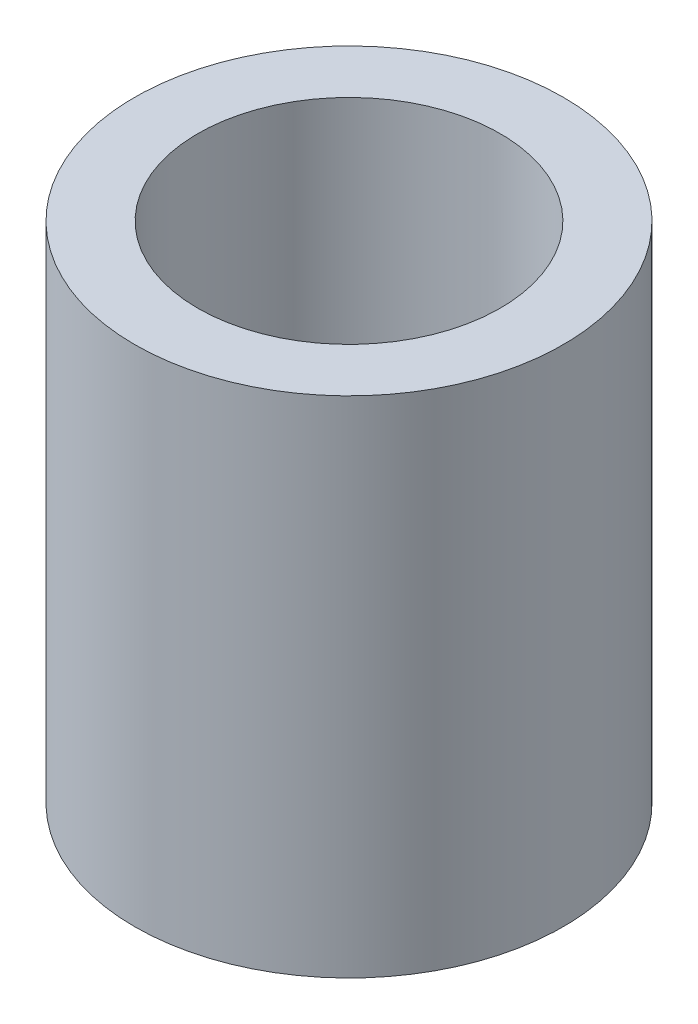
ISO-10303-21;
HEADER;
FILE_DESCRIPTION(('STEP AP214'),'2;1');
FILE_NAME('part.step','',(''),(''),'','','');
FILE_SCHEMA(('AUTOMOTIVE_DESIGN { 1 0 10303 214 1 1 1 1 }'));
ENDSEC;
DATA;
#1=APPLICATION_CONTEXT('core data for automotive mechanical design processes');
#2=APPLICATION_PROTOCOL_DEFINITION('international standard','automotive_design',2000,#1);
#3=PRODUCT_CONTEXT('',#1,'mechanical');
#4=PRODUCT('Part','Part','',(#3));
#5=PRODUCT_RELATED_PRODUCT_CATEGORY('part','',(#4));
#6=PRODUCT_DEFINITION_FORMATION('','',#4);
#7=PRODUCT_DEFINITION_CONTEXT('part definition',#1,'design');
#8=PRODUCT_DEFINITION('design','',#6,#7);
#9=PRODUCT_DEFINITION_SHAPE('','',#8);
#10=(LENGTH_UNIT() NAMED_UNIT(*) SI_UNIT(.MILLI.,.METRE.));
#11=(NAMED_UNIT(*) PLANE_ANGLE_UNIT() SI_UNIT($,.RADIAN.));
#12=(NAMED_UNIT(*) SI_UNIT($,.STERADIAN.) SOLID_ANGLE_UNIT());
#13=UNCERTAINTY_MEASURE_WITH_UNIT(LENGTH_MEASURE(1.E-05),#10,'distance_accuracy_value','');
#14=(GEOMETRIC_REPRESENTATION_CONTEXT(3) GLOBAL_UNCERTAINTY_ASSIGNED_CONTEXT((#13)) GLOBAL_UNIT_ASSIGNED_CONTEXT((#10,
#11,#12)) REPRESENTATION_CONTEXT('',''));
#15=CARTESIAN_POINT('',(0.,0.,0.));
#16=DIRECTION('',(0.,0.,1.));
#17=DIRECTION('',(1.,0.,0.));
#18=AXIS2_PLACEMENT_3D('',#15,#16,#17);
#19=CARTESIAN_POINT('',(0.,20.,0.));
#20=DIRECTION('',(0.,1.,0.));
#21=DIRECTION('',(0.,0.,1.));
#22=AXIS2_PLACEMENT_3D('',#19,#20,#21);
#23=PLANE('',#22);
#24=CARTESIAN_POINT('',(0.,20.,0.));
#25=DIRECTION('',(0.,1.,0.));
#26=DIRECTION('',(0.,0.,1.));
#27=AXIS2_PLACEMENT_3D('',#24,#25,#26);
#28=CIRCLE('',#27,8.5);
#29=CARTESIAN_POINT('',(0.,20.,8.5));
#30=VERTEX_POINT('',#29);
#31=EDGE_CURVE('E10',#30,#30,#28,.T.);
#32=ORIENTED_EDGE('',*,*,#31,.T.);
#33=EDGE_LOOP('',(#32));
#34=FACE_BOUND('',#33,.T.);
#35=CARTESIAN_POINT('',(0.,20.,0.));
#36=DIRECTION('',(0.,1.,0.));
#37=DIRECTION('',(0.,0.,1.));
#38=AXIS2_PLACEMENT_3D('',#35,#36,#37);
#39=CIRCLE('',#38,6.);
#40=CARTESIAN_POINT('',(0.,20.,6.));
#41=VERTEX_POINT('',#40);
#42=EDGE_CURVE('E50',#41,#41,#39,.T.);
#43=ORIENTED_EDGE('',*,*,#42,.F.);
#44=EDGE_LOOP('',(#43));
#45=FACE_BOUND('',#44,.T.);
#46=ADVANCED_FACE('F37',(#34,#45),#23,.T.);
#47=CARTESIAN_POINT('',(0.,0.,0.));
#48=DIRECTION('',(0.,1.,0.));
#49=DIRECTION('',(0.,0.,1.));
#50=AXIS2_PLACEMENT_3D('',#47,#48,#49);
#51=PLANE('',#50);
#52=CARTESIAN_POINT('',(0.,0.,0.));
#53=DIRECTION('',(0.,1.,0.));
#54=DIRECTION('',(0.,0.,1.));
#55=AXIS2_PLACEMENT_3D('',#52,#53,#54);
#56=CIRCLE('',#55,8.5);
#57=CARTESIAN_POINT('',(0.,0.,8.5));
#58=VERTEX_POINT('',#57);
#59=EDGE_CURVE('E41',#58,#58,#56,.T.);
#60=ORIENTED_EDGE('',*,*,#59,.F.);
#61=EDGE_LOOP('',(#60));
#62=FACE_BOUND('',#61,.T.);
#63=CARTESIAN_POINT('',(0.,0.,0.));
#64=DIRECTION('',(0.,1.,0.));
#65=DIRECTION('',(0.,0.,1.));
#66=AXIS2_PLACEMENT_3D('',#63,#64,#65);
#67=CIRCLE('',#66,6.);
#68=CARTESIAN_POINT('',(0.,0.,6.));
#69=VERTEX_POINT('',#68);
#70=EDGE_CURVE('E52',#69,#69,#67,.T.);
#71=ORIENTED_EDGE('',*,*,#70,.T.);
#72=EDGE_LOOP('',(#71));
#73=FACE_BOUND('',#72,.T.);
#74=ADVANCED_FACE('F64',(#62,#73),#51,.F.);
#75=CARTESIAN_POINT('',(0.,20.,0.));
#76=DIRECTION('',(0.,-1.,0.));
#77=DIRECTION('',(0.,0.,-1.));
#78=AXIS2_PLACEMENT_3D('',#75,#76,#77);
#79=CYLINDRICAL_SURFACE('',#78,8.5);
#80=ORIENTED_EDGE('',*,*,#31,.F.);
#81=EDGE_LOOP('',(#80));
#82=FACE_BOUND('',#81,.T.);
#83=ORIENTED_EDGE('',*,*,#59,.T.);
#84=EDGE_LOOP('',(#83));
#85=FACE_BOUND('',#84,.T.);
#86=ADVANCED_FACE('F39',(#82,#85),#79,.T.);
#87=CARTESIAN_POINT('',(0.,20.,0.));
#88=DIRECTION('',(0.,-1.,0.));
#89=DIRECTION('',(0.,0.,-1.));
#90=AXIS2_PLACEMENT_3D('',#87,#88,#89);
#91=CYLINDRICAL_SURFACE('',#90,6.);
#92=ORIENTED_EDGE('',*,*,#42,.T.);
#93=EDGE_LOOP('',(#92));
#94=FACE_BOUND('',#93,.T.);
#95=ORIENTED_EDGE('',*,*,#70,.F.);
#96=EDGE_LOOP('',(#95));
#97=FACE_BOUND('',#96,.T.);
#98=ADVANCED_FACE('F60',(#94,#97),#91,.F.);
#99=CLOSED_SHELL('',(#46,#74,#86,#98));
#100=MANIFOLD_SOLID_BREP('B2',#99);
#101=ADVANCED_BREP_SHAPE_REPRESENTATION('',(#18,#100),#14);
#102=SHAPE_DEFINITION_REPRESENTATION(#9,#101);
ENDSEC;
END-ISO-10303-21;
